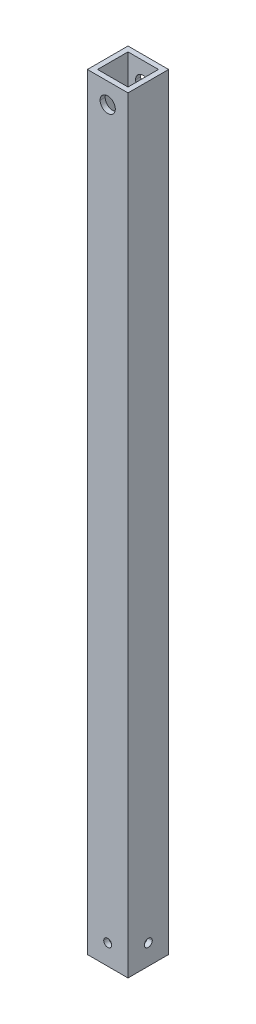
ISO-10303-21;
HEADER;
FILE_DESCRIPTION(('STEP AP214'),'2;1');
FILE_NAME('part.step','',(''),(''),'','','');
FILE_SCHEMA(('AUTOMOTIVE_DESIGN { 1 0 10303 214 1 1 1 1 }'));
ENDSEC;
DATA;
#1=APPLICATION_CONTEXT('core data for automotive mechanical design processes');
#2=APPLICATION_PROTOCOL_DEFINITION('international standard','automotive_design',2000,#1);
#3=PRODUCT_CONTEXT('',#1,'mechanical');
#4=PRODUCT('Part','Part','',(#3));
#5=PRODUCT_RELATED_PRODUCT_CATEGORY('part','',(#4));
#6=PRODUCT_DEFINITION_FORMATION('','',#4);
#7=PRODUCT_DEFINITION_CONTEXT('part definition',#1,'design');
#8=PRODUCT_DEFINITION('design','',#6,#7);
#9=PRODUCT_DEFINITION_SHAPE('','',#8);
#10=(LENGTH_UNIT() NAMED_UNIT(*) SI_UNIT(.MILLI.,.METRE.));
#11=(NAMED_UNIT(*) PLANE_ANGLE_UNIT() SI_UNIT($,.RADIAN.));
#12=(NAMED_UNIT(*) SI_UNIT($,.STERADIAN.) SOLID_ANGLE_UNIT());
#13=UNCERTAINTY_MEASURE_WITH_UNIT(LENGTH_MEASURE(1.E-05),#10,'distance_accuracy_value','');
#14=(GEOMETRIC_REPRESENTATION_CONTEXT(3) GLOBAL_UNCERTAINTY_ASSIGNED_CONTEXT((#13)) GLOBAL_UNIT_ASSIGNED_CONTEXT((#10,
#11,#12)) REPRESENTATION_CONTEXT('',''));
#15=CARTESIAN_POINT('',(0.,0.,0.));
#16=DIRECTION('',(0.,0.,1.));
#17=DIRECTION('',(1.,0.,0.));
#18=AXIS2_PLACEMENT_3D('',#15,#16,#17);
#19=CARTESIAN_POINT('',(-12.7,-227.0125,0.));
#20=DIRECTION('',(1.,0.,0.));
#21=DIRECTION('',(0.,0.,-1.));
#22=AXIS2_PLACEMENT_3D('',#19,#20,#21);
#23=CYLINDRICAL_SURFACE('',#22,2.4892);
#24=DIRECTION('',(1.,0.,0.));
#25=VECTOR('',#24,1.);
#26=CARTESIAN_POINT('',(-12.7,-227.0125,2.4892));
#27=LINE('',#26,#25);
#28=CARTESIAN_POINT('',(9.525,-227.0125,2.4892));
#29=VERTEX_POINT('',#28);
#30=CARTESIAN_POINT('',(12.7,-227.0125,2.4892));
#31=VERTEX_POINT('',#30);
#32=EDGE_CURVE('E411',#29,#31,#27,.T.);
#33=ORIENTED_EDGE('',*,*,#32,.F.);
#34=CARTESIAN_POINT('',(9.525,-227.0125,0.));
#35=DIRECTION('',(-1.,0.,0.));
#36=DIRECTION('',(0.,0.,1.));
#37=AXIS2_PLACEMENT_3D('',#34,#35,#36);
#38=CIRCLE('',#37,2.4892);
#39=CARTESIAN_POINT('',(9.525,-227.0125,-2.4892));
#40=VERTEX_POINT('',#39);
#41=EDGE_CURVE('E298',#29,#40,#38,.T.);
#42=ORIENTED_EDGE('',*,*,#41,.T.);
#43=DIRECTION('',(1.,0.,0.));
#44=VECTOR('',#43,1.);
#45=CARTESIAN_POINT('',(-12.7,-227.0125,-2.4892));
#46=LINE('',#45,#44);
#47=CARTESIAN_POINT('',(12.7,-227.0125,-2.4892));
#48=VERTEX_POINT('',#47);
#49=EDGE_CURVE('E229',#40,#48,#46,.T.);
#50=ORIENTED_EDGE('',*,*,#49,.T.);
#51=CARTESIAN_POINT('',(12.7,-227.0125,0.));
#52=DIRECTION('',(1.,0.,0.));
#53=DIRECTION('',(0.,0.,-1.));
#54=AXIS2_PLACEMENT_3D('',#51,#52,#53);
#55=CIRCLE('',#54,2.4892);
#56=EDGE_CURVE('E327',#48,#31,#55,.T.);
#57=ORIENTED_EDGE('',*,*,#56,.T.);
#58=EDGE_LOOP('',(#33,#42,#50,#57));
#59=FACE_BOUND('',#58,.T.);
#60=ADVANCED_FACE('F17',(#59),#23,.F.);
#61=CARTESIAN_POINT('',(-12.7,-227.0125,0.));
#62=DIRECTION('',(1.,0.,0.));
#63=DIRECTION('',(0.,0.,-1.));
#64=AXIS2_PLACEMENT_3D('',#61,#62,#63);
#65=CYLINDRICAL_SURFACE('',#64,2.4892);
#66=DIRECTION('',(1.,0.,0.));
#67=VECTOR('',#66,1.);
#68=CARTESIAN_POINT('',(-12.7,-227.0125,2.4892));
#69=LINE('',#68,#67);
#70=CARTESIAN_POINT('',(-12.7,-227.0125,2.4892));
#71=VERTEX_POINT('',#70);
#72=CARTESIAN_POINT('',(-9.525,-227.0125,2.4892));
#73=VERTEX_POINT('',#72);
#74=EDGE_CURVE('E260',#71,#73,#69,.T.);
#75=ORIENTED_EDGE('',*,*,#74,.F.);
#76=CARTESIAN_POINT('',(-12.7,-227.0125,0.));
#77=DIRECTION('',(1.,0.,0.));
#78=DIRECTION('',(0.,0.,-1.));
#79=AXIS2_PLACEMENT_3D('',#76,#77,#78);
#80=CIRCLE('',#79,2.4892);
#81=CARTESIAN_POINT('',(-12.7,-227.0125,-2.4892));
#82=VERTEX_POINT('',#81);
#83=EDGE_CURVE('E364',#82,#71,#80,.T.);
#84=ORIENTED_EDGE('',*,*,#83,.F.);
#85=DIRECTION('',(1.,0.,0.));
#86=VECTOR('',#85,1.);
#87=CARTESIAN_POINT('',(-12.7,-227.0125,-2.4892));
#88=LINE('',#87,#86);
#89=CARTESIAN_POINT('',(-9.525,-227.0125,-2.4892));
#90=VERTEX_POINT('',#89);
#91=EDGE_CURVE('E259',#82,#90,#88,.T.);
#92=ORIENTED_EDGE('',*,*,#91,.T.);
#93=CARTESIAN_POINT('',(-9.525,-227.0125,0.));
#94=DIRECTION('',(1.,0.,0.));
#95=DIRECTION('',(0.,0.,-1.));
#96=AXIS2_PLACEMENT_3D('',#93,#94,#95);
#97=CIRCLE('',#96,2.4892);
#98=EDGE_CURVE('E242',#90,#73,#97,.T.);
#99=ORIENTED_EDGE('',*,*,#98,.T.);
#100=EDGE_LOOP('',(#75,#84,#92,#99));
#101=FACE_BOUND('',#100,.T.);
#102=ADVANCED_FACE('F691',(#101),#65,.F.);
#103=CARTESIAN_POINT('',(0.,-227.0125,-12.7));
#104=DIRECTION('',(0.,0.,1.));
#105=DIRECTION('',(1.,0.,0.));
#106=AXIS2_PLACEMENT_3D('',#103,#104,#105);
#107=CYLINDRICAL_SURFACE('',#106,2.4892);
#108=DIRECTION('',(0.,0.,1.));
#109=VECTOR('',#108,1.);
#110=CARTESIAN_POINT('',(-2.4892,-227.0125,-12.7));
#111=LINE('',#110,#109);
#112=CARTESIAN_POINT('',(-2.4892,-227.0125,-12.7));
#113=VERTEX_POINT('',#112);
#114=CARTESIAN_POINT('',(-2.4892,-227.0125,-9.525));
#115=VERTEX_POINT('',#114);
#116=EDGE_CURVE('E272',#113,#115,#111,.T.);
#117=ORIENTED_EDGE('',*,*,#116,.F.);
#118=CARTESIAN_POINT('',(0.,-227.0125,-12.7));
#119=DIRECTION('',(0.,0.,1.));
#120=DIRECTION('',(1.,0.,0.));
#121=AXIS2_PLACEMENT_3D('',#118,#119,#120);
#122=CIRCLE('',#121,2.4892);
#123=CARTESIAN_POINT('',(2.4892,-227.0125,-12.7));
#124=VERTEX_POINT('',#123);
#125=EDGE_CURVE('E312',#124,#113,#122,.T.);
#126=ORIENTED_EDGE('',*,*,#125,.F.);
#127=DIRECTION('',(0.,0.,1.));
#128=VECTOR('',#127,1.);
#129=CARTESIAN_POINT('',(2.4892,-227.0125,-12.7));
#130=LINE('',#129,#128);
#131=CARTESIAN_POINT('',(2.4892,-227.0125,-9.525));
#132=VERTEX_POINT('',#131);
#133=EDGE_CURVE('E271',#124,#132,#130,.T.);
#134=ORIENTED_EDGE('',*,*,#133,.T.);
#135=CARTESIAN_POINT('',(0.,-227.0125,-9.525));
#136=DIRECTION('',(0.,0.,1.));
#137=DIRECTION('',(1.,0.,0.));
#138=AXIS2_PLACEMENT_3D('',#135,#136,#137);
#139=CIRCLE('',#138,2.4892);
#140=EDGE_CURVE('E203',#132,#115,#139,.T.);
#141=ORIENTED_EDGE('',*,*,#140,.T.);
#142=EDGE_LOOP('',(#117,#126,#134,#141));
#143=FACE_BOUND('',#142,.T.);
#144=ADVANCED_FACE('F470',(#143),#107,.F.);
#145=CARTESIAN_POINT('',(0.,227.0125,-12.7));
#146=DIRECTION('',(0.,0.,1.));
#147=DIRECTION('',(1.,0.,0.));
#148=AXIS2_PLACEMENT_3D('',#145,#146,#147);
#149=CYLINDRICAL_SURFACE('',#148,4.7625);
#150=DIRECTION('',(0.,0.,1.));
#151=VECTOR('',#150,1.);
#152=CARTESIAN_POINT('',(-4.7625,227.0125,-12.7));
#153=LINE('',#152,#151);
#154=CARTESIAN_POINT('',(-4.7625,227.0125,-12.7));
#155=VERTEX_POINT('',#154);
#156=CARTESIAN_POINT('',(-4.7625,227.0125,-9.525));
#157=VERTEX_POINT('',#156);
#158=EDGE_CURVE('E216',#155,#157,#153,.T.);
#159=ORIENTED_EDGE('',*,*,#158,.F.);
#160=CARTESIAN_POINT('',(0.,227.0125,-12.7));
#161=DIRECTION('',(0.,0.,1.));
#162=DIRECTION('',(1.,0.,0.));
#163=AXIS2_PLACEMENT_3D('',#160,#161,#162);
#164=CIRCLE('',#163,4.7625);
#165=CARTESIAN_POINT('',(4.7625,227.0125,-12.7));
#166=VERTEX_POINT('',#165);
#167=EDGE_CURVE('E208',#166,#155,#164,.T.);
#168=ORIENTED_EDGE('',*,*,#167,.F.);
#169=DIRECTION('',(0.,0.,1.));
#170=VECTOR('',#169,1.);
#171=CARTESIAN_POINT('',(4.7625,227.0125,-12.7));
#172=LINE('',#171,#170);
#173=CARTESIAN_POINT('',(4.7625,227.0125,-9.525));
#174=VERTEX_POINT('',#173);
#175=EDGE_CURVE('E206',#166,#174,#172,.T.);
#176=ORIENTED_EDGE('',*,*,#175,.T.);
#177=CARTESIAN_POINT('',(0.,227.0125,-9.525));
#178=DIRECTION('',(0.,0.,1.));
#179=DIRECTION('',(1.,0.,0.));
#180=AXIS2_PLACEMENT_3D('',#177,#178,#179);
#181=CIRCLE('',#180,4.7625);
#182=EDGE_CURVE('E193',#174,#157,#181,.T.);
#183=ORIENTED_EDGE('',*,*,#182,.T.);
#184=EDGE_LOOP('',(#159,#168,#176,#183));
#185=FACE_BOUND('',#184,.T.);
#186=ADVANCED_FACE('F207',(#185),#149,.F.);
#187=CARTESIAN_POINT('',(0.,-227.0125,-12.7));
#188=DIRECTION('',(0.,0.,1.));
#189=DIRECTION('',(1.,0.,0.));
#190=AXIS2_PLACEMENT_3D('',#187,#188,#189);
#191=CYLINDRICAL_SURFACE('',#190,2.4892);
#192=DIRECTION('',(0.,0.,1.));
#193=VECTOR('',#192,1.);
#194=CARTESIAN_POINT('',(-2.4892,-227.0125,-12.7));
#195=LINE('',#194,#193);
#196=CARTESIAN_POINT('',(-2.4892,-227.0125,9.525));
#197=VERTEX_POINT('',#196);
#198=CARTESIAN_POINT('',(-2.4892,-227.0125,12.7));
#199=VERTEX_POINT('',#198);
#200=EDGE_CURVE('E273',#197,#199,#195,.T.);
#201=ORIENTED_EDGE('',*,*,#200,.F.);
#202=CARTESIAN_POINT('',(0.,-227.0125,9.525));
#203=DIRECTION('',(0.,0.,-1.));
#204=DIRECTION('',(-1.,0.,0.));
#205=AXIS2_PLACEMENT_3D('',#202,#203,#204);
#206=CIRCLE('',#205,2.4892);
#207=CARTESIAN_POINT('',(2.4892,-227.0125,9.525));
#208=VERTEX_POINT('',#207);
#209=EDGE_CURVE('E28',#197,#208,#206,.T.);
#210=ORIENTED_EDGE('',*,*,#209,.T.);
#211=DIRECTION('',(0.,0.,1.));
#212=VECTOR('',#211,1.);
#213=CARTESIAN_POINT('',(2.4892,-227.0125,-12.7));
#214=LINE('',#213,#212);
#215=CARTESIAN_POINT('',(2.4892,-227.0125,12.7));
#216=VERTEX_POINT('',#215);
#217=EDGE_CURVE('E243',#208,#216,#214,.T.);
#218=ORIENTED_EDGE('',*,*,#217,.T.);
#219=CARTESIAN_POINT('',(0.,-227.0125,12.7));
#220=DIRECTION('',(0.,0.,1.));
#221=DIRECTION('',(1.,0.,0.));
#222=AXIS2_PLACEMENT_3D('',#219,#220,#221);
#223=CIRCLE('',#222,2.4892);
#224=EDGE_CURVE('E254',#216,#199,#223,.T.);
#225=ORIENTED_EDGE('',*,*,#224,.T.);
#226=EDGE_LOOP('',(#201,#210,#218,#225));
#227=FACE_BOUND('',#226,.T.);
#228=ADVANCED_FACE('F448',(#227),#191,.F.);
#229=CARTESIAN_POINT('',(0.,227.0125,-12.7));
#230=DIRECTION('',(0.,0.,1.));
#231=DIRECTION('',(1.,0.,0.));
#232=AXIS2_PLACEMENT_3D('',#229,#230,#231);
#233=CYLINDRICAL_SURFACE('',#232,4.7625);
#234=DIRECTION('',(0.,0.,1.));
#235=VECTOR('',#234,1.);
#236=CARTESIAN_POINT('',(-4.7625,227.0125,-12.7));
#237=LINE('',#236,#235);
#238=CARTESIAN_POINT('',(-4.7625,227.0125,9.525));
#239=VERTEX_POINT('',#238);
#240=CARTESIAN_POINT('',(-4.7625,227.0125,12.7));
#241=VERTEX_POINT('',#240);
#242=EDGE_CURVE('E291',#239,#241,#237,.T.);
#243=ORIENTED_EDGE('',*,*,#242,.F.);
#244=CARTESIAN_POINT('',(0.,227.0125,9.525));
#245=DIRECTION('',(0.,0.,-1.));
#246=DIRECTION('',(-1.,0.,0.));
#247=AXIS2_PLACEMENT_3D('',#244,#245,#246);
#248=CIRCLE('',#247,4.7625);
#249=CARTESIAN_POINT('',(4.7625,227.0125,9.525));
#250=VERTEX_POINT('',#249);
#251=EDGE_CURVE('E11',#239,#250,#248,.T.);
#252=ORIENTED_EDGE('',*,*,#251,.T.);
#253=DIRECTION('',(0.,0.,1.));
#254=VECTOR('',#253,1.);
#255=CARTESIAN_POINT('',(4.7625,227.0125,-12.7));
#256=LINE('',#255,#254);
#257=CARTESIAN_POINT('',(4.7625,227.0125,12.7));
#258=VERTEX_POINT('',#257);
#259=EDGE_CURVE('E317',#250,#258,#256,.T.);
#260=ORIENTED_EDGE('',*,*,#259,.T.);
#261=CARTESIAN_POINT('',(0.,227.0125,12.7));
#262=DIRECTION('',(0.,0.,1.));
#263=DIRECTION('',(1.,0.,0.));
#264=AXIS2_PLACEMENT_3D('',#261,#262,#263);
#265=CIRCLE('',#264,4.7625);
#266=EDGE_CURVE('E249',#258,#241,#265,.T.);
#267=ORIENTED_EDGE('',*,*,#266,.T.);
#268=EDGE_LOOP('',(#243,#252,#260,#267));
#269=FACE_BOUND('',#268,.T.);
#270=ADVANCED_FACE('F437',(#269),#233,.F.);
#271=CARTESIAN_POINT('',(0.,239.7125,9.525));
#272=DIRECTION('',(0.,0.,-1.));
#273=DIRECTION('',(0.,-1.,0.));
#274=AXIS2_PLACEMENT_3D('',#271,#272,#273);
#275=PLANE('',#274);
#276=CARTESIAN_POINT('',(0.,227.0125,9.525));
#277=DIRECTION('',(0.,0.,-1.));
#278=DIRECTION('',(-1.,0.,0.));
#279=AXIS2_PLACEMENT_3D('',#276,#277,#278);
#280=CIRCLE('',#279,4.7625);
#281=EDGE_CURVE('E247',#250,#239,#280,.T.);
#282=ORIENTED_EDGE('',*,*,#281,.F.);
#283=ORIENTED_EDGE('',*,*,#251,.F.);
#284=EDGE_LOOP('',(#282,#283));
#285=FACE_BOUND('',#284,.T.);
#286=CARTESIAN_POINT('',(0.,-227.0125,9.525));
#287=DIRECTION('',(0.,0.,-1.));
#288=DIRECTION('',(-1.,0.,0.));
#289=AXIS2_PLACEMENT_3D('',#286,#287,#288);
#290=CIRCLE('',#289,2.4892);
#291=EDGE_CURVE('E213',#208,#197,#290,.T.);
#292=ORIENTED_EDGE('',*,*,#291,.F.);
#293=ORIENTED_EDGE('',*,*,#209,.F.);
#294=EDGE_LOOP('',(#292,#293));
#295=FACE_BOUND('',#294,.T.);
#296=DIRECTION('',(1.,0.,0.));
#297=VECTOR('',#296,1.);
#298=CARTESIAN_POINT('',(0.,-239.7125,9.525));
#299=LINE('',#298,#297);
#300=CARTESIAN_POINT('',(-9.525,-239.7125,9.525));
#301=VERTEX_POINT('',#300);
#302=CARTESIAN_POINT('',(9.525,-239.7125,9.525));
#303=VERTEX_POINT('',#302);
#304=EDGE_CURVE('E261',#301,#303,#299,.T.);
#305=ORIENTED_EDGE('',*,*,#304,.F.);
#306=DIRECTION('',(0.,-1.,0.));
#307=VECTOR('',#306,1.);
#308=CARTESIAN_POINT('',(-9.525,239.7125,9.525));
#309=LINE('',#308,#307);
#310=CARTESIAN_POINT('',(-9.525,239.7125,9.525));
#311=VERTEX_POINT('',#310);
#312=EDGE_CURVE('E43',#311,#301,#309,.T.);
#313=ORIENTED_EDGE('',*,*,#312,.F.);
#314=DIRECTION('',(1.,0.,0.));
#315=VECTOR('',#314,1.);
#316=CARTESIAN_POINT('',(0.,239.7125,9.525));
#317=LINE('',#316,#315);
#318=CARTESIAN_POINT('',(9.525,239.7125,9.525));
#319=VERTEX_POINT('',#318);
#320=EDGE_CURVE('E308',#311,#319,#317,.T.);
#321=ORIENTED_EDGE('',*,*,#320,.T.);
#322=DIRECTION('',(0.,-1.,0.));
#323=VECTOR('',#322,1.);
#324=CARTESIAN_POINT('',(9.525,239.7125,9.525));
#325=LINE('',#324,#323);
#326=EDGE_CURVE('E253',#319,#303,#325,.T.);
#327=ORIENTED_EDGE('',*,*,#326,.T.);
#328=EDGE_LOOP('',(#305,#313,#321,#327));
#329=FACE_BOUND('',#328,.T.);
#330=ADVANCED_FACE('F587',(#285,#295,#329),#275,.T.);
#331=CARTESIAN_POINT('',(-9.525,239.7125,0.));
#332=DIRECTION('',(1.,0.,0.));
#333=DIRECTION('',(0.,1.,0.));
#334=AXIS2_PLACEMENT_3D('',#331,#332,#333);
#335=PLANE('',#334);
#336=ORIENTED_EDGE('',*,*,#98,.F.);
#337=CARTESIAN_POINT('',(-9.525,-227.0125,0.));
#338=DIRECTION('',(1.,0.,0.));
#339=DIRECTION('',(0.,0.,-1.));
#340=AXIS2_PLACEMENT_3D('',#337,#338,#339);
#341=CIRCLE('',#340,2.4892);
#342=EDGE_CURVE('E255',#73,#90,#341,.T.);
#343=ORIENTED_EDGE('',*,*,#342,.F.);
#344=EDGE_LOOP('',(#336,#343));
#345=FACE_BOUND('',#344,.T.);
#346=DIRECTION('',(0.,0.,1.));
#347=VECTOR('',#346,1.);
#348=CARTESIAN_POINT('',(-9.525,-239.7125,0.));
#349=LINE('',#348,#347);
#350=CARTESIAN_POINT('',(-9.525,-239.7125,-9.525));
#351=VERTEX_POINT('',#350);
#352=EDGE_CURVE('E266',#351,#301,#349,.T.);
#353=ORIENTED_EDGE('',*,*,#352,.F.);
#354=DIRECTION('',(0.,-1.,0.));
#355=VECTOR('',#354,1.);
#356=CARTESIAN_POINT('',(-9.525,239.7125,-9.525));
#357=LINE('',#356,#355);
#358=CARTESIAN_POINT('',(-9.525,239.7125,-9.525));
#359=VERTEX_POINT('',#358);
#360=EDGE_CURVE('E227',#359,#351,#357,.T.);
#361=ORIENTED_EDGE('',*,*,#360,.F.);
#362=DIRECTION('',(0.,0.,1.));
#363=VECTOR('',#362,1.);
#364=CARTESIAN_POINT('',(-9.525,239.7125,0.));
#365=LINE('',#364,#363);
#366=EDGE_CURVE('E304',#359,#311,#365,.T.);
#367=ORIENTED_EDGE('',*,*,#366,.T.);
#368=ORIENTED_EDGE('',*,*,#312,.T.);
#369=EDGE_LOOP('',(#353,#361,#367,#368));
#370=FACE_BOUND('',#369,.T.);
#371=ADVANCED_FACE('F476',(#345,#370),#335,.T.);
#372=CARTESIAN_POINT('',(0.,239.7125,-9.525));
#373=DIRECTION('',(0.,0.,1.));
#374=DIRECTION('',(1.,0.,0.));
#375=AXIS2_PLACEMENT_3D('',#372,#373,#374);
#376=PLANE('',#375);
#377=ORIENTED_EDGE('',*,*,#182,.F.);
#378=CARTESIAN_POINT('',(0.,227.0125,-9.525));
#379=DIRECTION('',(0.,0.,1.));
#380=DIRECTION('',(1.,0.,0.));
#381=AXIS2_PLACEMENT_3D('',#378,#379,#380);
#382=CIRCLE('',#381,4.7625);
#383=EDGE_CURVE('E198',#157,#174,#382,.T.);
#384=ORIENTED_EDGE('',*,*,#383,.F.);
#385=EDGE_LOOP('',(#377,#384));
#386=FACE_BOUND('',#385,.T.);
#387=ORIENTED_EDGE('',*,*,#140,.F.);
#388=CARTESIAN_POINT('',(0.,-227.0125,-9.525));
#389=DIRECTION('',(0.,0.,1.));
#390=DIRECTION('',(1.,0.,0.));
#391=AXIS2_PLACEMENT_3D('',#388,#389,#390);
#392=CIRCLE('',#391,2.4892);
#393=EDGE_CURVE('E267',#115,#132,#392,.T.);
#394=ORIENTED_EDGE('',*,*,#393,.F.);
#395=EDGE_LOOP('',(#387,#394));
#396=FACE_BOUND('',#395,.T.);
#397=DIRECTION('',(-1.,0.,0.));
#398=VECTOR('',#397,1.);
#399=CARTESIAN_POINT('',(0.,-239.7125,-9.525));
#400=LINE('',#399,#398);
#401=CARTESIAN_POINT('',(9.525,-239.7125,-9.525));
#402=VERTEX_POINT('',#401);
#403=EDGE_CURVE('E277',#402,#351,#400,.T.);
#404=ORIENTED_EDGE('',*,*,#403,.F.);
#405=DIRECTION('',(0.,-1.,0.));
#406=VECTOR('',#405,1.);
#407=CARTESIAN_POINT('',(9.525,239.7125,-9.525));
#408=LINE('',#407,#406);
#409=CARTESIAN_POINT('',(9.525,239.7125,-9.525));
#410=VERTEX_POINT('',#409);
#411=EDGE_CURVE('E301',#410,#402,#408,.T.);
#412=ORIENTED_EDGE('',*,*,#411,.F.);
#413=DIRECTION('',(-1.,0.,0.));
#414=VECTOR('',#413,1.);
#415=CARTESIAN_POINT('',(0.,239.7125,-9.525));
#416=LINE('',#415,#414);
#417=EDGE_CURVE('E292',#410,#359,#416,.T.);
#418=ORIENTED_EDGE('',*,*,#417,.T.);
#419=ORIENTED_EDGE('',*,*,#360,.T.);
#420=EDGE_LOOP('',(#404,#412,#418,#419));
#421=FACE_BOUND('',#420,.T.);
#422=ADVANCED_FACE('F195',(#386,#396,#421),#376,.T.);
#423=CARTESIAN_POINT('',(9.525,239.7125,0.));
#424=DIRECTION('',(-1.,0.,0.));
#425=DIRECTION('',(0.,0.,1.));
#426=AXIS2_PLACEMENT_3D('',#423,#424,#425);
#427=PLANE('',#426);
#428=CARTESIAN_POINT('',(9.525,-227.0125,0.));
#429=DIRECTION('',(-1.,0.,0.));
#430=DIRECTION('',(0.,0.,1.));
#431=AXIS2_PLACEMENT_3D('',#428,#429,#430);
#432=CIRCLE('',#431,2.4892);
#433=EDGE_CURVE('E415',#40,#29,#432,.T.);
#434=ORIENTED_EDGE('',*,*,#433,.F.);
#435=ORIENTED_EDGE('',*,*,#41,.F.);
#436=EDGE_LOOP('',(#434,#435));
#437=FACE_BOUND('',#436,.T.);
#438=DIRECTION('',(0.,0.,-1.));
#439=VECTOR('',#438,1.);
#440=CARTESIAN_POINT('',(9.525,-239.7125,0.));
#441=LINE('',#440,#439);
#442=EDGE_CURVE('E281',#303,#402,#441,.T.);
#443=ORIENTED_EDGE('',*,*,#442,.F.);
#444=ORIENTED_EDGE('',*,*,#326,.F.);
#445=DIRECTION('',(0.,0.,-1.));
#446=VECTOR('',#445,1.);
#447=CARTESIAN_POINT('',(9.525,239.7125,0.));
#448=LINE('',#447,#446);
#449=EDGE_CURVE('E296',#319,#410,#448,.T.);
#450=ORIENTED_EDGE('',*,*,#449,.T.);
#451=ORIENTED_EDGE('',*,*,#411,.T.);
#452=EDGE_LOOP('',(#443,#444,#450,#451));
#453=FACE_BOUND('',#452,.T.);
#454=ADVANCED_FACE('F442',(#437,#453),#427,.T.);
#455=CARTESIAN_POINT('',(-12.7,239.7125,12.7));
#456=DIRECTION('',(0.,0.,-1.));
#457=DIRECTION('',(0.,-1.,0.));
#458=AXIS2_PLACEMENT_3D('',#455,#456,#457);
#459=PLANE('',#458);
#460=ORIENTED_EDGE('',*,*,#266,.F.);
#461=CARTESIAN_POINT('',(0.,227.0125,12.7));
#462=DIRECTION('',(0.,0.,1.));
#463=DIRECTION('',(1.,0.,0.));
#464=AXIS2_PLACEMENT_3D('',#461,#462,#463);
#465=CIRCLE('',#464,4.7625);
#466=EDGE_CURVE('E321',#241,#258,#465,.T.);
#467=ORIENTED_EDGE('',*,*,#466,.F.);
#468=EDGE_LOOP('',(#460,#467));
#469=FACE_BOUND('',#468,.T.);
#470=ORIENTED_EDGE('',*,*,#224,.F.);
#471=CARTESIAN_POINT('',(0.,-227.0125,12.7));
#472=DIRECTION('',(0.,0.,1.));
#473=DIRECTION('',(1.,0.,0.));
#474=AXIS2_PLACEMENT_3D('',#471,#472,#473);
#475=CIRCLE('',#474,2.4892);
#476=EDGE_CURVE('E248',#199,#216,#475,.T.);
#477=ORIENTED_EDGE('',*,*,#476,.F.);
#478=EDGE_LOOP('',(#470,#477));
#479=FACE_BOUND('',#478,.T.);
#480=DIRECTION('',(1.,0.,0.));
#481=VECTOR('',#480,1.);
#482=CARTESIAN_POINT('',(-12.7,-239.7125,12.7));
#483=LINE('',#482,#481);
#484=CARTESIAN_POINT('',(-12.7,-239.7125,12.7));
#485=VERTEX_POINT('',#484);
#486=CARTESIAN_POINT('',(12.7,-239.7125,12.7));
#487=VERTEX_POINT('',#486);
#488=EDGE_CURVE('E385',#485,#487,#483,.T.);
#489=ORIENTED_EDGE('',*,*,#488,.T.);
#490=DIRECTION('',(0.,-1.,0.));
#491=VECTOR('',#490,1.);
#492=CARTESIAN_POINT('',(12.7,239.7125,12.7));
#493=LINE('',#492,#491);
#494=CARTESIAN_POINT('',(12.7,239.7125,12.7));
#495=VERTEX_POINT('',#494);
#496=EDGE_CURVE('E330',#495,#487,#493,.T.);
#497=ORIENTED_EDGE('',*,*,#496,.F.);
#498=DIRECTION('',(1.,0.,0.));
#499=VECTOR('',#498,1.);
#500=CARTESIAN_POINT('',(-12.7,239.7125,12.7));
#501=LINE('',#500,#499);
#502=CARTESIAN_POINT('',(-12.7,239.7125,12.7));
#503=VERTEX_POINT('',#502);
#504=EDGE_CURVE('E297',#503,#495,#501,.T.);
#505=ORIENTED_EDGE('',*,*,#504,.F.);
#506=DIRECTION('',(0.,-1.,0.));
#507=VECTOR('',#506,1.);
#508=CARTESIAN_POINT('',(-12.7,239.7125,12.7));
#509=LINE('',#508,#507);
#510=EDGE_CURVE('E311',#503,#485,#509,.T.);
#511=ORIENTED_EDGE('',*,*,#510,.T.);
#512=EDGE_LOOP('',(#489,#497,#505,#511));
#513=FACE_BOUND('',#512,.T.);
#514=ADVANCED_FACE('F439',(#469,#479,#513),#459,.F.);
#515=CARTESIAN_POINT('',(-12.7,239.7125,12.7));
#516=DIRECTION('',(1.,0.,0.));
#517=DIRECTION('',(0.,1.,0.));
#518=AXIS2_PLACEMENT_3D('',#515,#516,#517);
#519=PLANE('',#518);
#520=ORIENTED_EDGE('',*,*,#83,.T.);
#521=CARTESIAN_POINT('',(-12.7,-227.0125,0.));
#522=DIRECTION('',(1.,0.,0.));
#523=DIRECTION('',(0.,0.,-1.));
#524=AXIS2_PLACEMENT_3D('',#521,#522,#523);
#525=CIRCLE('',#524,2.4892);
#526=EDGE_CURVE('E21',#71,#82,#525,.T.);
#527=ORIENTED_EDGE('',*,*,#526,.T.);
#528=EDGE_LOOP('',(#520,#527));
#529=FACE_BOUND('',#528,.T.);
#530=DIRECTION('',(0.,0.,1.));
#531=VECTOR('',#530,1.);
#532=CARTESIAN_POINT('',(-12.7,-239.7125,12.7));
#533=LINE('',#532,#531);
#534=CARTESIAN_POINT('',(-12.7,-239.7125,-12.7));
#535=VERTEX_POINT('',#534);
#536=EDGE_CURVE('E349',#535,#485,#533,.T.);
#537=ORIENTED_EDGE('',*,*,#536,.T.);
#538=ORIENTED_EDGE('',*,*,#510,.F.);
#539=DIRECTION('',(0.,0.,1.));
#540=VECTOR('',#539,1.);
#541=CARTESIAN_POINT('',(-12.7,239.7125,12.7));
#542=LINE('',#541,#540);
#543=CARTESIAN_POINT('',(-12.7,239.7125,-12.7));
#544=VERTEX_POINT('',#543);
#545=EDGE_CURVE('E238',#544,#503,#542,.T.);
#546=ORIENTED_EDGE('',*,*,#545,.F.);
#547=DIRECTION('',(0.,-1.,0.));
#548=VECTOR('',#547,1.);
#549=CARTESIAN_POINT('',(-12.7,239.7125,-12.7));
#550=LINE('',#549,#548);
#551=EDGE_CURVE('E329',#544,#535,#550,.T.);
#552=ORIENTED_EDGE('',*,*,#551,.T.);
#553=EDGE_LOOP('',(#537,#538,#546,#552));
#554=FACE_BOUND('',#553,.T.);
#555=ADVANCED_FACE('F19',(#529,#554),#519,.F.);
#556=CARTESIAN_POINT('',(-12.7,239.7125,-12.7));
#557=DIRECTION('',(0.,0.,1.));
#558=DIRECTION('',(1.,0.,0.));
#559=AXIS2_PLACEMENT_3D('',#556,#557,#558);
#560=PLANE('',#559);
#561=ORIENTED_EDGE('',*,*,#167,.T.);
#562=CARTESIAN_POINT('',(0.,227.0125,-12.7));
#563=DIRECTION('',(0.,0.,1.));
#564=DIRECTION('',(1.,0.,0.));
#565=AXIS2_PLACEMENT_3D('',#562,#563,#564);
#566=CIRCLE('',#565,4.7625);
#567=EDGE_CURVE('E223',#155,#166,#566,.T.);
#568=ORIENTED_EDGE('',*,*,#567,.T.);
#569=EDGE_LOOP('',(#561,#568));
#570=FACE_BOUND('',#569,.T.);
#571=ORIENTED_EDGE('',*,*,#125,.T.);
#572=CARTESIAN_POINT('',(0.,-227.0125,-12.7));
#573=DIRECTION('',(0.,0.,1.));
#574=DIRECTION('',(1.,0.,0.));
#575=AXIS2_PLACEMENT_3D('',#572,#573,#574);
#576=CIRCLE('',#575,2.4892);
#577=EDGE_CURVE('E316',#113,#124,#576,.T.);
#578=ORIENTED_EDGE('',*,*,#577,.T.);
#579=EDGE_LOOP('',(#571,#578));
#580=FACE_BOUND('',#579,.T.);
#581=DIRECTION('',(-1.,0.,0.));
#582=VECTOR('',#581,1.);
#583=CARTESIAN_POINT('',(-12.7,-239.7125,-12.7));
#584=LINE('',#583,#582);
#585=CARTESIAN_POINT('',(12.7,-239.7125,-12.7));
#586=VERTEX_POINT('',#585);
#587=EDGE_CURVE('E372',#586,#535,#584,.T.);
#588=ORIENTED_EDGE('',*,*,#587,.T.);
#589=ORIENTED_EDGE('',*,*,#551,.F.);
#590=DIRECTION('',(-1.,0.,0.));
#591=VECTOR('',#590,1.);
#592=CARTESIAN_POINT('',(-12.7,239.7125,-12.7));
#593=LINE('',#592,#591);
#594=CARTESIAN_POINT('',(12.7,239.7125,-12.7));
#595=VERTEX_POINT('',#594);
#596=EDGE_CURVE('E234',#595,#544,#593,.T.);
#597=ORIENTED_EDGE('',*,*,#596,.F.);
#598=DIRECTION('',(0.,-1.,0.));
#599=VECTOR('',#598,1.);
#600=CARTESIAN_POINT('',(12.7,239.7125,-12.7));
#601=LINE('',#600,#599);
#602=EDGE_CURVE('E265',#595,#586,#601,.T.);
#603=ORIENTED_EDGE('',*,*,#602,.T.);
#604=EDGE_LOOP('',(#588,#589,#597,#603));
#605=FACE_BOUND('',#604,.T.);
#606=ADVANCED_FACE('F466',(#570,#580,#605),#560,.F.);
#607=CARTESIAN_POINT('',(12.7,239.7125,12.7));
#608=DIRECTION('',(-1.,0.,0.));
#609=DIRECTION('',(0.,0.,1.));
#610=AXIS2_PLACEMENT_3D('',#607,#608,#609);
#611=PLANE('',#610);
#612=ORIENTED_EDGE('',*,*,#56,.F.);
#613=CARTESIAN_POINT('',(12.7,-227.0125,0.));
#614=DIRECTION('',(1.,0.,0.));
#615=DIRECTION('',(0.,0.,-1.));
#616=AXIS2_PLACEMENT_3D('',#613,#614,#615);
#617=CIRCLE('',#616,2.4892);
#618=EDGE_CURVE('E233',#31,#48,#617,.T.);
#619=ORIENTED_EDGE('',*,*,#618,.F.);
#620=EDGE_LOOP('',(#612,#619));
#621=FACE_BOUND('',#620,.T.);
#622=DIRECTION('',(0.,0.,-1.));
#623=VECTOR('',#622,1.);
#624=CARTESIAN_POINT('',(12.7,-239.7125,12.7));
#625=LINE('',#624,#623);
#626=EDGE_CURVE('E307',#487,#586,#625,.T.);
#627=ORIENTED_EDGE('',*,*,#626,.T.);
#628=ORIENTED_EDGE('',*,*,#602,.F.);
#629=DIRECTION('',(0.,0.,-1.));
#630=VECTOR('',#629,1.);
#631=CARTESIAN_POINT('',(12.7,239.7125,12.7));
#632=LINE('',#631,#630);
#633=EDGE_CURVE('E239',#495,#595,#632,.T.);
#634=ORIENTED_EDGE('',*,*,#633,.F.);
#635=ORIENTED_EDGE('',*,*,#496,.T.);
#636=EDGE_LOOP('',(#627,#628,#634,#635));
#637=FACE_BOUND('',#636,.T.);
#638=ADVANCED_FACE('F609',(#621,#637),#611,.F.);
#639=CARTESIAN_POINT('',(0.,-239.7125,0.));
#640=DIRECTION('',(0.,1.,0.));
#641=DIRECTION('',(1.,0.,0.));
#642=AXIS2_PLACEMENT_3D('',#639,#640,#641);
#643=PLANE('',#642);
#644=ORIENTED_EDGE('',*,*,#442,.T.);
#645=ORIENTED_EDGE('',*,*,#403,.T.);
#646=ORIENTED_EDGE('',*,*,#352,.T.);
#647=ORIENTED_EDGE('',*,*,#304,.T.);
#648=EDGE_LOOP('',(#644,#645,#646,#647));
#649=FACE_BOUND('',#648,.T.);
#650=ORIENTED_EDGE('',*,*,#626,.F.);
#651=ORIENTED_EDGE('',*,*,#488,.F.);
#652=ORIENTED_EDGE('',*,*,#536,.F.);
#653=ORIENTED_EDGE('',*,*,#587,.F.);
#654=EDGE_LOOP('',(#650,#651,#652,#653));
#655=FACE_BOUND('',#654,.T.);
#656=ADVANCED_FACE('F482',(#649,#655),#643,.F.);
#657=CARTESIAN_POINT('',(0.,239.7125,0.));
#658=DIRECTION('',(0.,1.,0.));
#659=DIRECTION('',(1.,0.,0.));
#660=AXIS2_PLACEMENT_3D('',#657,#658,#659);
#661=PLANE('',#660);
#662=ORIENTED_EDGE('',*,*,#417,.F.);
#663=ORIENTED_EDGE('',*,*,#449,.F.);
#664=ORIENTED_EDGE('',*,*,#320,.F.);
#665=ORIENTED_EDGE('',*,*,#366,.F.);
#666=EDGE_LOOP('',(#662,#663,#664,#665));
#667=FACE_BOUND('',#666,.T.);
#668=ORIENTED_EDGE('',*,*,#633,.T.);
#669=ORIENTED_EDGE('',*,*,#596,.T.);
#670=ORIENTED_EDGE('',*,*,#545,.T.);
#671=ORIENTED_EDGE('',*,*,#504,.T.);
#672=EDGE_LOOP('',(#668,#669,#670,#671));
#673=FACE_BOUND('',#672,.T.);
#674=ADVANCED_FACE('F491',(#667,#673),#661,.T.);
#675=CARTESIAN_POINT('',(0.,227.0125,-12.7));
#676=DIRECTION('',(0.,0.,1.));
#677=DIRECTION('',(1.,0.,0.));
#678=AXIS2_PLACEMENT_3D('',#675,#676,#677);
#679=CYLINDRICAL_SURFACE('',#678,4.7625);
#680=ORIENTED_EDGE('',*,*,#281,.T.);
#681=ORIENTED_EDGE('',*,*,#242,.T.);
#682=ORIENTED_EDGE('',*,*,#466,.T.);
#683=ORIENTED_EDGE('',*,*,#259,.F.);
#684=EDGE_LOOP('',(#680,#681,#682,#683));
#685=FACE_BOUND('',#684,.T.);
#686=ADVANCED_FACE('F432',(#685),#679,.F.);
#687=CARTESIAN_POINT('',(0.,-227.0125,-12.7));
#688=DIRECTION('',(0.,0.,1.));
#689=DIRECTION('',(1.,0.,0.));
#690=AXIS2_PLACEMENT_3D('',#687,#688,#689);
#691=CYLINDRICAL_SURFACE('',#690,2.4892);
#692=ORIENTED_EDGE('',*,*,#291,.T.);
#693=ORIENTED_EDGE('',*,*,#200,.T.);
#694=ORIENTED_EDGE('',*,*,#476,.T.);
#695=ORIENTED_EDGE('',*,*,#217,.F.);
#696=EDGE_LOOP('',(#692,#693,#694,#695));
#697=FACE_BOUND('',#696,.T.);
#698=ADVANCED_FACE('F452',(#697),#691,.F.);
#699=CARTESIAN_POINT('',(0.,227.0125,-12.7));
#700=DIRECTION('',(0.,0.,1.));
#701=DIRECTION('',(1.,0.,0.));
#702=AXIS2_PLACEMENT_3D('',#699,#700,#701);
#703=CYLINDRICAL_SURFACE('',#702,4.7625);
#704=ORIENTED_EDGE('',*,*,#567,.F.);
#705=ORIENTED_EDGE('',*,*,#158,.T.);
#706=ORIENTED_EDGE('',*,*,#383,.T.);
#707=ORIENTED_EDGE('',*,*,#175,.F.);
#708=EDGE_LOOP('',(#704,#705,#706,#707));
#709=FACE_BOUND('',#708,.T.);
#710=ADVANCED_FACE('F215',(#709),#703,.F.);
#711=CARTESIAN_POINT('',(0.,-227.0125,-12.7));
#712=DIRECTION('',(0.,0.,1.));
#713=DIRECTION('',(1.,0.,0.));
#714=AXIS2_PLACEMENT_3D('',#711,#712,#713);
#715=CYLINDRICAL_SURFACE('',#714,2.4892);
#716=ORIENTED_EDGE('',*,*,#577,.F.);
#717=ORIENTED_EDGE('',*,*,#116,.T.);
#718=ORIENTED_EDGE('',*,*,#393,.T.);
#719=ORIENTED_EDGE('',*,*,#133,.F.);
#720=EDGE_LOOP('',(#716,#717,#718,#719));
#721=FACE_BOUND('',#720,.T.);
#722=ADVANCED_FACE('F473',(#721),#715,.F.);
#723=CARTESIAN_POINT('',(-12.7,-227.0125,0.));
#724=DIRECTION('',(1.,0.,0.));
#725=DIRECTION('',(0.,0.,-1.));
#726=AXIS2_PLACEMENT_3D('',#723,#724,#725);
#727=CYLINDRICAL_SURFACE('',#726,2.4892);
#728=ORIENTED_EDGE('',*,*,#526,.F.);
#729=ORIENTED_EDGE('',*,*,#74,.T.);
#730=ORIENTED_EDGE('',*,*,#342,.T.);
#731=ORIENTED_EDGE('',*,*,#91,.F.);
#732=EDGE_LOOP('',(#728,#729,#730,#731));
#733=FACE_BOUND('',#732,.T.);
#734=ADVANCED_FACE('F595',(#733),#727,.F.);
#735=CARTESIAN_POINT('',(-12.7,-227.0125,0.));
#736=DIRECTION('',(1.,0.,0.));
#737=DIRECTION('',(0.,0.,-1.));
#738=AXIS2_PLACEMENT_3D('',#735,#736,#737);
#739=CYLINDRICAL_SURFACE('',#738,2.4892);
#740=ORIENTED_EDGE('',*,*,#433,.T.);
#741=ORIENTED_EDGE('',*,*,#32,.T.);
#742=ORIENTED_EDGE('',*,*,#618,.T.);
#743=ORIENTED_EDGE('',*,*,#49,.F.);
#744=EDGE_LOOP('',(#740,#741,#742,#743));
#745=FACE_BOUND('',#744,.T.);
#746=ADVANCED_FACE('F600',(#745),#739,.F.);
#747=CLOSED_SHELL('',(#60,#102,#144,#186,#228,#270,#330,#371,#422,#454,#514,#555,#606,#638,#656,
#674,#686,#698,#710,#722,#734,#746));
#748=MANIFOLD_SOLID_BREP('B1',#747);
#749=ADVANCED_BREP_SHAPE_REPRESENTATION('',(#18,#748),#14);
#750=SHAPE_DEFINITION_REPRESENTATION(#9,#749);
ENDSEC;
END-ISO-10303-21;
